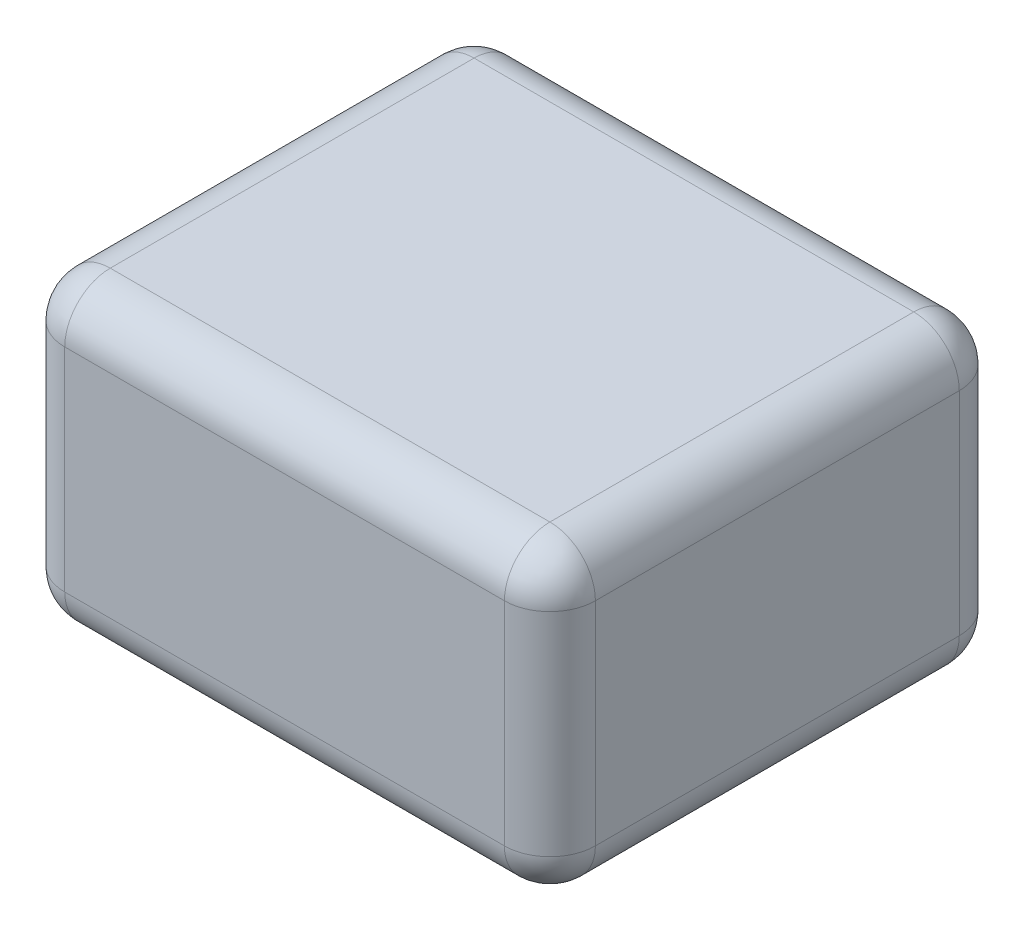
ISO-10303-21;
HEADER;
FILE_DESCRIPTION(('STEP AP214'),'2;1');
FILE_NAME('part.step','',(''),(''),'','','');
FILE_SCHEMA(('AUTOMOTIVE_DESIGN { 1 0 10303 214 1 1 1 1 }'));
ENDSEC;
DATA;
#1=APPLICATION_CONTEXT('core data for automotive mechanical design processes');
#2=APPLICATION_PROTOCOL_DEFINITION('international standard','automotive_design',2000,#1);
#3=PRODUCT_CONTEXT('',#1,'mechanical');
#4=PRODUCT('Part','Part','',(#3));
#5=PRODUCT_RELATED_PRODUCT_CATEGORY('part','',(#4));
#6=PRODUCT_DEFINITION_FORMATION('','',#4);
#7=PRODUCT_DEFINITION_CONTEXT('part definition',#1,'design');
#8=PRODUCT_DEFINITION('design','',#6,#7);
#9=PRODUCT_DEFINITION_SHAPE('','',#8);
#10=(LENGTH_UNIT() NAMED_UNIT(*) SI_UNIT(.MILLI.,.METRE.));
#11=(NAMED_UNIT(*) PLANE_ANGLE_UNIT() SI_UNIT($,.RADIAN.));
#12=(NAMED_UNIT(*) SI_UNIT($,.STERADIAN.) SOLID_ANGLE_UNIT());
#13=UNCERTAINTY_MEASURE_WITH_UNIT(LENGTH_MEASURE(1.E-05),#10,'distance_accuracy_value','');
#14=(GEOMETRIC_REPRESENTATION_CONTEXT(3) GLOBAL_UNCERTAINTY_ASSIGNED_CONTEXT((#13)) GLOBAL_UNIT_ASSIGNED_CONTEXT((#10,
#11,#12)) REPRESENTATION_CONTEXT('',''));
#15=CARTESIAN_POINT('',(0.,0.,0.));
#16=DIRECTION('',(0.,0.,1.));
#17=DIRECTION('',(1.,0.,0.));
#18=AXIS2_PLACEMENT_3D('',#15,#16,#17);
#19=CARTESIAN_POINT('',(-116.59189935397,-359.777465672961,30.));
#20=DIRECTION('',(1.,0.,0.));
#21=DIRECTION('',(0.,0.,-1.));
#22=AXIS2_PLACEMENT_3D('',#19,#20,#21);
#23=PLANE('',#22);
#24=DIRECTION('',(0.,0.,-1.));
#25=VECTOR('',#24,1.);
#26=CARTESIAN_POINT('',(-116.59189935397,-362.777465672962,30.));
#27=LINE('',#26,#25);
#28=CARTESIAN_POINT('',(-116.59189935397,-362.777465672962,27.));
#29=VERTEX_POINT('',#28);
#30=CARTESIAN_POINT('',(-116.59189935397,-362.777465672962,3.));
#31=VERTEX_POINT('',#30);
#32=EDGE_CURVE('E170',#29,#31,#27,.T.);
#33=ORIENTED_EDGE('',*,*,#32,.T.);
#34=DIRECTION('',(0.,-1.,0.));
#35=VECTOR('',#34,1.);
#36=CARTESIAN_POINT('',(-116.59189935397,-359.777465672961,3.));
#37=LINE('',#36,#35);
#38=CARTESIAN_POINT('',(-116.59189935397,-376.777465672961,3.));
#39=VERTEX_POINT('',#38);
#40=EDGE_CURVE('E175',#31,#39,#37,.T.);
#41=ORIENTED_EDGE('',*,*,#40,.T.);
#42=DIRECTION('',(0.,0.,-1.));
#43=VECTOR('',#42,1.);
#44=CARTESIAN_POINT('',(-116.59189935397,-376.777465672961,30.));
#45=LINE('',#44,#43);
#46=CARTESIAN_POINT('',(-116.59189935397,-376.777465672961,27.));
#47=VERTEX_POINT('',#46);
#48=EDGE_CURVE('E172',#39,#47,#45,.F.);
#49=ORIENTED_EDGE('',*,*,#48,.T.);
#50=DIRECTION('',(0.,-1.,0.));
#51=VECTOR('',#50,1.);
#52=CARTESIAN_POINT('',(-116.59189935397,-359.777465672961,27.));
#53=LINE('',#52,#51);
#54=EDGE_CURVE('E168',#47,#29,#53,.F.);
#55=ORIENTED_EDGE('',*,*,#54,.T.);
#56=EDGE_LOOP('',(#33,#41,#49,#55));
#57=FACE_BOUND('',#56,.T.);
#58=ADVANCED_FACE('F37',(#57),#23,.F.);
#59=CARTESIAN_POINT('',(-116.59189935397,-379.777465672961,30.));
#60=DIRECTION('',(0.,1.,0.));
#61=DIRECTION('',(-1.,0.,0.));
#62=AXIS2_PLACEMENT_3D('',#59,#60,#61);
#63=PLANE('',#62);
#64=DIRECTION('',(0.,0.,-1.));
#65=VECTOR('',#64,1.);
#66=CARTESIAN_POINT('',(-113.59189935397,-379.777465672961,30.));
#67=LINE('',#66,#65);
#68=CARTESIAN_POINT('',(-113.59189935397,-379.777465672961,27.));
#69=VERTEX_POINT('',#68);
#70=CARTESIAN_POINT('',(-113.59189935397,-379.777465672961,3.));
#71=VERTEX_POINT('',#70);
#72=EDGE_CURVE('E139',#69,#71,#67,.T.);
#73=ORIENTED_EDGE('',*,*,#72,.T.);
#74=DIRECTION('',(1.,0.,0.));
#75=VECTOR('',#74,1.);
#76=CARTESIAN_POINT('',(-116.59189935397,-379.777465672961,3.));
#77=LINE('',#76,#75);
#78=CARTESIAN_POINT('',(-84.5918993539698,-379.777465672962,3.));
#79=VERTEX_POINT('',#78);
#80=EDGE_CURVE('E135',#71,#79,#77,.T.);
#81=ORIENTED_EDGE('',*,*,#80,.T.);
#82=DIRECTION('',(0.,0.,-1.));
#83=VECTOR('',#82,1.);
#84=CARTESIAN_POINT('',(-84.5918993539698,-379.777465672962,30.));
#85=LINE('',#84,#83);
#86=CARTESIAN_POINT('',(-84.5918993539698,-379.777465672962,27.));
#87=VERTEX_POINT('',#86);
#88=EDGE_CURVE('E128',#79,#87,#85,.F.);
#89=ORIENTED_EDGE('',*,*,#88,.T.);
#90=DIRECTION('',(1.,0.,0.));
#91=VECTOR('',#90,1.);
#92=CARTESIAN_POINT('',(-116.59189935397,-379.777465672961,27.));
#93=LINE('',#92,#91);
#94=EDGE_CURVE('E133',#87,#69,#93,.F.);
#95=ORIENTED_EDGE('',*,*,#94,.T.);
#96=EDGE_LOOP('',(#73,#81,#89,#95));
#97=FACE_BOUND('',#96,.T.);
#98=ADVANCED_FACE('F131',(#97),#63,.F.);
#99=CARTESIAN_POINT('',(-81.5918993539698,-359.777465672961,30.));
#100=DIRECTION('',(-1.,0.,0.));
#101=DIRECTION('',(0.,0.,1.));
#102=AXIS2_PLACEMENT_3D('',#99,#100,#101);
#103=PLANE('',#102);
#104=DIRECTION('',(0.,0.,-1.));
#105=VECTOR('',#104,1.);
#106=CARTESIAN_POINT('',(-81.5918993539698,-376.777465672962,30.));
#107=LINE('',#106,#105);
#108=CARTESIAN_POINT('',(-81.5918993539698,-376.777465672962,27.));
#109=VERTEX_POINT('',#108);
#110=CARTESIAN_POINT('',(-81.5918993539698,-376.777465672962,3.));
#111=VERTEX_POINT('',#110);
#112=EDGE_CURVE('E147',#109,#111,#107,.T.);
#113=ORIENTED_EDGE('',*,*,#112,.T.);
#114=DIRECTION('',(0.,1.,0.));
#115=VECTOR('',#114,1.);
#116=CARTESIAN_POINT('',(-81.5918993539698,-359.777465672961,3.));
#117=LINE('',#116,#115);
#118=CARTESIAN_POINT('',(-81.5918993539698,-362.777465672962,3.));
#119=VERTEX_POINT('',#118);
#120=EDGE_CURVE('E191',#111,#119,#117,.T.);
#121=ORIENTED_EDGE('',*,*,#120,.T.);
#122=DIRECTION('',(0.,0.,-1.));
#123=VECTOR('',#122,1.);
#124=CARTESIAN_POINT('',(-81.5918993539698,-362.777465672962,30.));
#125=LINE('',#124,#123);
#126=CARTESIAN_POINT('',(-81.5918993539698,-362.777465672962,27.));
#127=VERTEX_POINT('',#126);
#128=EDGE_CURVE('E188',#119,#127,#125,.F.);
#129=ORIENTED_EDGE('',*,*,#128,.T.);
#130=DIRECTION('',(0.,1.,0.));
#131=VECTOR('',#130,1.);
#132=CARTESIAN_POINT('',(-81.5918993539698,-379.777465672962,27.));
#133=LINE('',#132,#131);
#134=EDGE_CURVE('E186',#127,#109,#133,.F.);
#135=ORIENTED_EDGE('',*,*,#134,.T.);
#136=EDGE_LOOP('',(#113,#121,#129,#135));
#137=FACE_BOUND('',#136,.T.);
#138=ADVANCED_FACE('F301',(#137),#103,.F.);
#139=CARTESIAN_POINT('',(-116.59189935397,-359.777465672961,30.));
#140=DIRECTION('',(0.,-1.,0.));
#141=DIRECTION('',(0.,0.,-1.));
#142=AXIS2_PLACEMENT_3D('',#139,#140,#141);
#143=PLANE('',#142);
#144=DIRECTION('',(0.,0.,-1.));
#145=VECTOR('',#144,1.);
#146=CARTESIAN_POINT('',(-84.5918993539698,-359.777465672961,30.));
#147=LINE('',#146,#145);
#148=CARTESIAN_POINT('',(-84.5918993539698,-359.777465672961,27.));
#149=VERTEX_POINT('',#148);
#150=CARTESIAN_POINT('',(-84.5918993539698,-359.777465672961,3.));
#151=VERTEX_POINT('',#150);
#152=EDGE_CURVE('E179',#149,#151,#147,.T.);
#153=ORIENTED_EDGE('',*,*,#152,.T.);
#154=DIRECTION('',(-1.,0.,0.));
#155=VECTOR('',#154,1.);
#156=CARTESIAN_POINT('',(-116.59189935397,-359.777465672961,3.));
#157=LINE('',#156,#155);
#158=CARTESIAN_POINT('',(-113.59189935397,-359.777465672961,3.));
#159=VERTEX_POINT('',#158);
#160=EDGE_CURVE('E184',#151,#159,#157,.T.);
#161=ORIENTED_EDGE('',*,*,#160,.T.);
#162=DIRECTION('',(0.,0.,-1.));
#163=VECTOR('',#162,1.);
#164=CARTESIAN_POINT('',(-113.59189935397,-359.777465672961,30.));
#165=LINE('',#164,#163);
#166=CARTESIAN_POINT('',(-113.59189935397,-359.777465672961,27.));
#167=VERTEX_POINT('',#166);
#168=EDGE_CURVE('E181',#159,#167,#165,.F.);
#169=ORIENTED_EDGE('',*,*,#168,.T.);
#170=DIRECTION('',(-1.,0.,0.));
#171=VECTOR('',#170,1.);
#172=CARTESIAN_POINT('',(-81.5918993539698,-359.777465672961,27.));
#173=LINE('',#172,#171);
#174=EDGE_CURVE('E177',#167,#149,#173,.F.);
#175=ORIENTED_EDGE('',*,*,#174,.T.);
#176=EDGE_LOOP('',(#153,#161,#169,#175));
#177=FACE_BOUND('',#176,.T.);
#178=ADVANCED_FACE('F278',(#177),#143,.F.);
#179=CARTESIAN_POINT('',(0.,0.,30.));
#180=DIRECTION('',(0.,0.,1.));
#181=DIRECTION('',(1.,0.,0.));
#182=AXIS2_PLACEMENT_3D('',#179,#180,#181);
#183=PLANE('',#182);
#184=DIRECTION('',(0.,-1.,0.));
#185=VECTOR('',#184,1.);
#186=CARTESIAN_POINT('',(-113.59189935397,-379.777465672961,30.));
#187=LINE('',#186,#185);
#188=CARTESIAN_POINT('',(-113.59189935397,-362.777465672962,30.));
#189=VERTEX_POINT('',#188);
#190=CARTESIAN_POINT('',(-113.59189935397,-376.777465672961,30.));
#191=VERTEX_POINT('',#190);
#192=EDGE_CURVE('E46',#189,#191,#187,.T.);
#193=ORIENTED_EDGE('',*,*,#192,.T.);
#194=DIRECTION('',(1.,0.,0.));
#195=VECTOR('',#194,1.);
#196=CARTESIAN_POINT('',(-81.5918993539698,-376.777465672962,30.));
#197=LINE('',#196,#195);
#198=CARTESIAN_POINT('',(-84.5918993539698,-376.777465672962,30.));
#199=VERTEX_POINT('',#198);
#200=EDGE_CURVE('E11',#191,#199,#197,.T.);
#201=ORIENTED_EDGE('',*,*,#200,.T.);
#202=DIRECTION('',(0.,1.,0.));
#203=VECTOR('',#202,1.);
#204=CARTESIAN_POINT('',(-84.5918993539698,-359.777465672961,30.));
#205=LINE('',#204,#203);
#206=CARTESIAN_POINT('',(-84.5918993539698,-362.777465672962,30.));
#207=VERTEX_POINT('',#206);
#208=EDGE_CURVE('E204',#199,#207,#205,.T.);
#209=ORIENTED_EDGE('',*,*,#208,.T.);
#210=DIRECTION('',(-1.,0.,0.));
#211=VECTOR('',#210,1.);
#212=CARTESIAN_POINT('',(-116.59189935397,-362.777465672962,30.));
#213=LINE('',#212,#211);
#214=EDGE_CURVE('E202',#207,#189,#213,.T.);
#215=ORIENTED_EDGE('',*,*,#214,.T.);
#216=EDGE_LOOP('',(#193,#201,#209,#215));
#217=FACE_BOUND('',#216,.T.);
#218=ADVANCED_FACE('F308',(#217),#183,.T.);
#219=CARTESIAN_POINT('',(0.,0.,0.));
#220=DIRECTION('',(0.,0.,1.));
#221=DIRECTION('',(1.,0.,0.));
#222=AXIS2_PLACEMENT_3D('',#219,#220,#221);
#223=PLANE('',#222);
#224=DIRECTION('',(0.,1.,0.));
#225=VECTOR('',#224,1.);
#226=CARTESIAN_POINT('',(-84.5918993539698,0.,0.));
#227=LINE('',#226,#225);
#228=CARTESIAN_POINT('',(-84.5918993539698,-362.777465672962,0.));
#229=VERTEX_POINT('',#228);
#230=CARTESIAN_POINT('',(-84.5918993539698,-376.777465672962,0.));
#231=VERTEX_POINT('',#230);
#232=EDGE_CURVE('E193',#229,#231,#227,.F.);
#233=ORIENTED_EDGE('',*,*,#232,.T.);
#234=DIRECTION('',(1.,0.,0.));
#235=VECTOR('',#234,1.);
#236=CARTESIAN_POINT('',(-5.97581453642909E-13,-376.777465672962,0.));
#237=LINE('',#236,#235);
#238=CARTESIAN_POINT('',(-113.59189935397,-376.777465672961,0.));
#239=VERTEX_POINT('',#238);
#240=EDGE_CURVE('E199',#231,#239,#237,.F.);
#241=ORIENTED_EDGE('',*,*,#240,.T.);
#242=DIRECTION('',(0.,-1.,0.));
#243=VECTOR('',#242,1.);
#244=CARTESIAN_POINT('',(-113.59189935397,0.,0.));
#245=LINE('',#244,#243);
#246=CARTESIAN_POINT('',(-113.59189935397,-362.777465672962,0.));
#247=VERTEX_POINT('',#246);
#248=EDGE_CURVE('E197',#239,#247,#245,.F.);
#249=ORIENTED_EDGE('',*,*,#248,.T.);
#250=DIRECTION('',(-1.,0.,0.));
#251=VECTOR('',#250,1.);
#252=CARTESIAN_POINT('',(0.,-362.777465672962,0.));
#253=LINE('',#252,#251);
#254=EDGE_CURVE('E195',#247,#229,#253,.F.);
#255=ORIENTED_EDGE('',*,*,#254,.T.);
#256=EDGE_LOOP('',(#233,#241,#249,#255));
#257=FACE_BOUND('',#256,.T.);
#258=ADVANCED_FACE('F269',(#257),#223,.F.);
#259=CARTESIAN_POINT('',(-84.5918993539698,-362.777465672962,30.));
#260=DIRECTION('',(0.,0.,-1.));
#261=DIRECTION('',(-1.,0.,0.));
#262=AXIS2_PLACEMENT_3D('',#259,#260,#261);
#263=CYLINDRICAL_SURFACE('',#262,3.);
#264=CARTESIAN_POINT('',(-84.5918993539698,-362.777465672962,27.));
#265=DIRECTION('',(0.,0.,1.));
#266=DIRECTION('',(1.,0.,0.));
#267=AXIS2_PLACEMENT_3D('',#264,#265,#266);
#268=CIRCLE('',#267,3.);
#269=EDGE_CURVE('E41',#127,#149,#268,.T.);
#270=ORIENTED_EDGE('',*,*,#269,.F.);
#271=ORIENTED_EDGE('',*,*,#128,.F.);
#272=CARTESIAN_POINT('',(-84.5918993539698,-362.777465672962,3.));
#273=DIRECTION('',(0.,0.,-1.));
#274=DIRECTION('',(-1.,0.,0.));
#275=AXIS2_PLACEMENT_3D('',#272,#273,#274);
#276=CIRCLE('',#275,3.);
#277=EDGE_CURVE('E164',#151,#119,#276,.T.);
#278=ORIENTED_EDGE('',*,*,#277,.F.);
#279=ORIENTED_EDGE('',*,*,#152,.F.);
#280=EDGE_LOOP('',(#270,#271,#278,#279));
#281=FACE_BOUND('',#280,.T.);
#282=ADVANCED_FACE('F39',(#281),#263,.T.);
#283=CARTESIAN_POINT('',(-84.5918993539698,-362.777465672962,27.));
#284=DIRECTION('',(0.,1.,0.));
#285=DIRECTION('',(0.,0.,1.));
#286=AXIS2_PLACEMENT_3D('',#283,#284,#285);
#287=SPHERICAL_SURFACE('',#286,3.);
#288=CARTESIAN_POINT('',(-84.5918993539698,-362.777465672962,27.));
#289=DIRECTION('',(0.,1.,0.));
#290=DIRECTION('',(0.,0.,1.));
#291=AXIS2_PLACEMENT_3D('',#288,#289,#290);
#292=CIRCLE('',#291,3.);
#293=EDGE_CURVE('E247',#127,#207,#292,.F.);
#294=ORIENTED_EDGE('',*,*,#293,.F.);
#295=ORIENTED_EDGE('',*,*,#269,.T.);
#296=CARTESIAN_POINT('',(-84.5918993539698,-362.777465672962,27.));
#297=DIRECTION('',(1.,0.,0.));
#298=DIRECTION('',(0.,0.,-1.));
#299=AXIS2_PLACEMENT_3D('',#296,#297,#298);
#300=CIRCLE('',#299,3.);
#301=EDGE_CURVE('E250',#207,#149,#300,.F.);
#302=ORIENTED_EDGE('',*,*,#301,.F.);
#303=EDGE_LOOP('',(#294,#295,#302));
#304=FACE_BOUND('',#303,.T.);
#305=ADVANCED_FACE('F296',(#304),#287,.T.);
#306=CARTESIAN_POINT('',(-84.5918993539698,-362.777465672962,3.));
#307=DIRECTION('',(1.,0.,0.));
#308=DIRECTION('',(0.,0.,-1.));
#309=AXIS2_PLACEMENT_3D('',#306,#307,#308);
#310=SPHERICAL_SURFACE('',#309,3.);
#311=CARTESIAN_POINT('',(-84.5918993539698,-362.777465672962,3.));
#312=DIRECTION('',(1.,0.,0.));
#313=DIRECTION('',(0.,0.,-1.));
#314=AXIS2_PLACEMENT_3D('',#311,#312,#313);
#315=CIRCLE('',#314,3.);
#316=EDGE_CURVE('E241',#151,#229,#315,.F.);
#317=ORIENTED_EDGE('',*,*,#316,.F.);
#318=ORIENTED_EDGE('',*,*,#277,.T.);
#319=CARTESIAN_POINT('',(-84.5918993539698,-362.777465672962,3.));
#320=DIRECTION('',(0.,1.,0.));
#321=DIRECTION('',(0.,0.,1.));
#322=AXIS2_PLACEMENT_3D('',#319,#320,#321);
#323=CIRCLE('',#322,3.);
#324=EDGE_CURVE('E244',#229,#119,#323,.F.);
#325=ORIENTED_EDGE('',*,*,#324,.F.);
#326=EDGE_LOOP('',(#317,#318,#325));
#327=FACE_BOUND('',#326,.T.);
#328=ADVANCED_FACE('F257',(#327),#310,.T.);
#329=CARTESIAN_POINT('',(0.,-362.777465672962,27.));
#330=DIRECTION('',(1.,0.,0.));
#331=DIRECTION('',(0.,0.,-1.));
#332=AXIS2_PLACEMENT_3D('',#329,#330,#331);
#333=CYLINDRICAL_SURFACE('',#332,3.);
#334=ORIENTED_EDGE('',*,*,#301,.T.);
#335=ORIENTED_EDGE('',*,*,#174,.F.);
#336=CARTESIAN_POINT('',(-113.59189935397,-362.777465672962,27.));
#337=DIRECTION('',(-1.,0.,0.));
#338=DIRECTION('',(0.,0.,1.));
#339=AXIS2_PLACEMENT_3D('',#336,#337,#338);
#340=CIRCLE('',#339,3.);
#341=EDGE_CURVE('E236',#189,#167,#340,.T.);
#342=ORIENTED_EDGE('',*,*,#341,.F.);
#343=ORIENTED_EDGE('',*,*,#214,.F.);
#344=EDGE_LOOP('',(#334,#335,#342,#343));
#345=FACE_BOUND('',#344,.T.);
#346=ADVANCED_FACE('F290',(#345),#333,.T.);
#347=CARTESIAN_POINT('',(-84.5918993539698,0.,27.));
#348=DIRECTION('',(0.,-1.,0.));
#349=DIRECTION('',(0.,0.,-1.));
#350=AXIS2_PLACEMENT_3D('',#347,#348,#349);
#351=CYLINDRICAL_SURFACE('',#350,3.);
#352=ORIENTED_EDGE('',*,*,#293,.T.);
#353=ORIENTED_EDGE('',*,*,#208,.F.);
#354=CARTESIAN_POINT('',(-84.5918993539698,-376.777465672962,27.));
#355=DIRECTION('',(0.,-1.,0.));
#356=DIRECTION('',(0.,0.,-1.));
#357=AXIS2_PLACEMENT_3D('',#354,#355,#356);
#358=CIRCLE('',#357,3.);
#359=EDGE_CURVE('E151',#109,#199,#358,.T.);
#360=ORIENTED_EDGE('',*,*,#359,.F.);
#361=ORIENTED_EDGE('',*,*,#134,.F.);
#362=EDGE_LOOP('',(#352,#353,#360,#361));
#363=FACE_BOUND('',#362,.T.);
#364=ADVANCED_FACE('F299',(#363),#351,.T.);
#365=CARTESIAN_POINT('',(-84.5918993539698,-376.777465672962,30.));
#366=DIRECTION('',(0.,0.,-1.));
#367=DIRECTION('',(-1.,0.,0.));
#368=AXIS2_PLACEMENT_3D('',#365,#366,#367);
#369=CYLINDRICAL_SURFACE('',#368,3.);
#370=CARTESIAN_POINT('',(-84.5918993539698,-376.777465672962,3.));
#371=DIRECTION('',(0.,0.,-1.));
#372=DIRECTION('',(-1.,0.,0.));
#373=AXIS2_PLACEMENT_3D('',#370,#371,#372);
#374=CIRCLE('',#373,3.);
#375=EDGE_CURVE('E152',#111,#79,#374,.T.);
#376=ORIENTED_EDGE('',*,*,#375,.F.);
#377=ORIENTED_EDGE('',*,*,#112,.F.);
#378=CARTESIAN_POINT('',(-84.5918993539698,-376.777465672962,27.));
#379=DIRECTION('',(0.,0.,1.));
#380=DIRECTION('',(1.,0.,0.));
#381=AXIS2_PLACEMENT_3D('',#378,#379,#380);
#382=CIRCLE('',#381,3.);
#383=EDGE_CURVE('E143',#87,#109,#382,.T.);
#384=ORIENTED_EDGE('',*,*,#383,.F.);
#385=ORIENTED_EDGE('',*,*,#88,.F.);
#386=EDGE_LOOP('',(#376,#377,#384,#385));
#387=FACE_BOUND('',#386,.T.);
#388=ADVANCED_FACE('F145',(#387),#369,.T.);
#389=CARTESIAN_POINT('',(-84.5918993539698,-359.777465672961,3.));
#390=DIRECTION('',(0.,1.,0.));
#391=DIRECTION('',(0.,0.,1.));
#392=AXIS2_PLACEMENT_3D('',#389,#390,#391);
#393=CYLINDRICAL_SURFACE('',#392,3.);
#394=ORIENTED_EDGE('',*,*,#324,.T.);
#395=ORIENTED_EDGE('',*,*,#120,.F.);
#396=CARTESIAN_POINT('',(-84.5918993539698,-376.777465672962,3.));
#397=DIRECTION('',(0.,-1.,0.));
#398=DIRECTION('',(0.,0.,-1.));
#399=AXIS2_PLACEMENT_3D('',#396,#397,#398);
#400=CIRCLE('',#399,3.);
#401=EDGE_CURVE('E232',#231,#111,#400,.T.);
#402=ORIENTED_EDGE('',*,*,#401,.F.);
#403=ORIENTED_EDGE('',*,*,#232,.F.);
#404=EDGE_LOOP('',(#394,#395,#402,#403));
#405=FACE_BOUND('',#404,.T.);
#406=ADVANCED_FACE('F265',(#405),#393,.T.);
#407=CARTESIAN_POINT('',(-116.59189935397,-362.777465672962,3.));
#408=DIRECTION('',(-1.,0.,0.));
#409=DIRECTION('',(0.,0.,1.));
#410=AXIS2_PLACEMENT_3D('',#407,#408,#409);
#411=CYLINDRICAL_SURFACE('',#410,3.);
#412=ORIENTED_EDGE('',*,*,#316,.T.);
#413=ORIENTED_EDGE('',*,*,#254,.F.);
#414=CARTESIAN_POINT('',(-113.59189935397,-362.777465672962,3.));
#415=DIRECTION('',(-1.,0.,0.));
#416=DIRECTION('',(0.,0.,1.));
#417=AXIS2_PLACEMENT_3D('',#414,#415,#416);
#418=CIRCLE('',#417,3.);
#419=EDGE_CURVE('E229',#159,#247,#418,.T.);
#420=ORIENTED_EDGE('',*,*,#419,.F.);
#421=ORIENTED_EDGE('',*,*,#160,.F.);
#422=EDGE_LOOP('',(#412,#413,#420,#421));
#423=FACE_BOUND('',#422,.T.);
#424=ADVANCED_FACE('F275',(#423),#411,.T.);
#425=CARTESIAN_POINT('',(-113.59189935397,-362.777465672962,30.));
#426=DIRECTION('',(0.,0.,-1.));
#427=DIRECTION('',(-1.,0.,0.));
#428=AXIS2_PLACEMENT_3D('',#425,#426,#427);
#429=CYLINDRICAL_SURFACE('',#428,3.);
#430=CARTESIAN_POINT('',(-113.59189935397,-362.777465672962,27.));
#431=DIRECTION('',(0.,0.,1.));
#432=DIRECTION('',(1.,0.,0.));
#433=AXIS2_PLACEMENT_3D('',#430,#431,#432);
#434=CIRCLE('',#433,3.);
#435=EDGE_CURVE('E238',#167,#29,#434,.T.);
#436=ORIENTED_EDGE('',*,*,#435,.F.);
#437=ORIENTED_EDGE('',*,*,#168,.F.);
#438=CARTESIAN_POINT('',(-113.59189935397,-362.777465672962,3.));
#439=DIRECTION('',(0.,0.,-1.));
#440=DIRECTION('',(-1.,0.,0.));
#441=AXIS2_PLACEMENT_3D('',#438,#439,#440);
#442=CIRCLE('',#441,3.);
#443=EDGE_CURVE('E226',#31,#159,#442,.T.);
#444=ORIENTED_EDGE('',*,*,#443,.F.);
#445=ORIENTED_EDGE('',*,*,#32,.F.);
#446=EDGE_LOOP('',(#436,#437,#444,#445));
#447=FACE_BOUND('',#446,.T.);
#448=ADVANCED_FACE('F282',(#447),#429,.T.);
#449=CARTESIAN_POINT('',(-113.59189935397,-362.777465672962,27.));
#450=DIRECTION('',(0.,1.,0.));
#451=DIRECTION('',(0.,0.,1.));
#452=AXIS2_PLACEMENT_3D('',#449,#450,#451);
#453=SPHERICAL_SURFACE('',#452,3.);
#454=ORIENTED_EDGE('',*,*,#341,.T.);
#455=ORIENTED_EDGE('',*,*,#435,.T.);
#456=CARTESIAN_POINT('',(-113.59189935397,-362.777465672962,27.));
#457=DIRECTION('',(0.,1.,0.));
#458=DIRECTION('',(0.,0.,1.));
#459=AXIS2_PLACEMENT_3D('',#456,#457,#458);
#460=CIRCLE('',#459,3.);
#461=EDGE_CURVE('E158',#189,#29,#460,.F.);
#462=ORIENTED_EDGE('',*,*,#461,.F.);
#463=EDGE_LOOP('',(#454,#455,#462));
#464=FACE_BOUND('',#463,.T.);
#465=ADVANCED_FACE('F352',(#464),#453,.T.);
#466=CARTESIAN_POINT('',(-84.5918993539698,-376.777465672962,27.));
#467=DIRECTION('',(1.,0.,0.));
#468=DIRECTION('',(0.,0.,-1.));
#469=AXIS2_PLACEMENT_3D('',#466,#467,#468);
#470=SPHERICAL_SURFACE('',#469,3.);
#471=ORIENTED_EDGE('',*,*,#383,.T.);
#472=ORIENTED_EDGE('',*,*,#359,.T.);
#473=CARTESIAN_POINT('',(-84.5918993539698,-376.777465672962,27.));
#474=DIRECTION('',(1.,0.,0.));
#475=DIRECTION('',(0.,0.,-1.));
#476=AXIS2_PLACEMENT_3D('',#473,#474,#475);
#477=CIRCLE('',#476,3.);
#478=EDGE_CURVE('E155',#87,#199,#477,.F.);
#479=ORIENTED_EDGE('',*,*,#478,.F.);
#480=EDGE_LOOP('',(#471,#472,#479));
#481=FACE_BOUND('',#480,.T.);
#482=ADVANCED_FACE('F156',(#481),#470,.T.);
#483=CARTESIAN_POINT('',(-84.5918993539698,-376.777465672962,3.));
#484=DIRECTION('',(1.,0.,0.));
#485=DIRECTION('',(0.,0.,-1.));
#486=AXIS2_PLACEMENT_3D('',#483,#484,#485);
#487=SPHERICAL_SURFACE('',#486,3.);
#488=ORIENTED_EDGE('',*,*,#401,.T.);
#489=ORIENTED_EDGE('',*,*,#375,.T.);
#490=CARTESIAN_POINT('',(-84.5918993539698,-376.777465672962,3.));
#491=DIRECTION('',(1.,0.,0.));
#492=DIRECTION('',(0.,0.,-1.));
#493=AXIS2_PLACEMENT_3D('',#490,#491,#492);
#494=CIRCLE('',#493,3.);
#495=EDGE_CURVE('E159',#231,#79,#494,.F.);
#496=ORIENTED_EDGE('',*,*,#495,.F.);
#497=EDGE_LOOP('',(#488,#489,#496));
#498=FACE_BOUND('',#497,.T.);
#499=ADVANCED_FACE('F345',(#498),#487,.T.);
#500=CARTESIAN_POINT('',(-113.59189935397,-362.777465672962,3.));
#501=DIRECTION('',(0.,1.,0.));
#502=DIRECTION('',(0.,0.,1.));
#503=AXIS2_PLACEMENT_3D('',#500,#501,#502);
#504=SPHERICAL_SURFACE('',#503,3.);
#505=ORIENTED_EDGE('',*,*,#443,.T.);
#506=ORIENTED_EDGE('',*,*,#419,.T.);
#507=CARTESIAN_POINT('',(-113.59189935397,-362.777465672962,3.));
#508=DIRECTION('',(0.,1.,0.));
#509=DIRECTION('',(0.,0.,1.));
#510=AXIS2_PLACEMENT_3D('',#507,#508,#509);
#511=CIRCLE('',#510,3.);
#512=EDGE_CURVE('E219',#31,#247,#511,.F.);
#513=ORIENTED_EDGE('',*,*,#512,.F.);
#514=EDGE_LOOP('',(#505,#506,#513));
#515=FACE_BOUND('',#514,.T.);
#516=ADVANCED_FACE('F341',(#515),#504,.T.);
#517=CARTESIAN_POINT('',(-113.59189935397,0.,27.));
#518=DIRECTION('',(0.,1.,0.));
#519=DIRECTION('',(0.,0.,1.));
#520=AXIS2_PLACEMENT_3D('',#517,#518,#519);
#521=CYLINDRICAL_SURFACE('',#520,3.);
#522=ORIENTED_EDGE('',*,*,#461,.T.);
#523=ORIENTED_EDGE('',*,*,#54,.F.);
#524=CARTESIAN_POINT('',(-113.59189935397,-376.777465672961,27.));
#525=DIRECTION('',(0.,-1.,0.));
#526=DIRECTION('',(0.,0.,-1.));
#527=AXIS2_PLACEMENT_3D('',#524,#525,#526);
#528=CIRCLE('',#527,3.);
#529=EDGE_CURVE('E217',#191,#47,#528,.T.);
#530=ORIENTED_EDGE('',*,*,#529,.F.);
#531=ORIENTED_EDGE('',*,*,#192,.F.);
#532=EDGE_LOOP('',(#522,#523,#530,#531));
#533=FACE_BOUND('',#532,.T.);
#534=ADVANCED_FACE('F338',(#533),#521,.T.);
#535=CARTESIAN_POINT('',(-5.97581453642909E-13,-376.777465672962,27.));
#536=DIRECTION('',(-1.,0.,0.));
#537=DIRECTION('',(0.,-1.,0.));
#538=AXIS2_PLACEMENT_3D('',#535,#536,#537);
#539=CYLINDRICAL_SURFACE('',#538,3.);
#540=ORIENTED_EDGE('',*,*,#478,.T.);
#541=ORIENTED_EDGE('',*,*,#200,.F.);
#542=CARTESIAN_POINT('',(-113.59189935397,-376.777465672961,27.));
#543=DIRECTION('',(-1.,0.,0.));
#544=DIRECTION('',(0.,0.,1.));
#545=AXIS2_PLACEMENT_3D('',#542,#543,#544);
#546=CIRCLE('',#545,3.);
#547=EDGE_CURVE('E54',#69,#191,#546,.T.);
#548=ORIENTED_EDGE('',*,*,#547,.F.);
#549=ORIENTED_EDGE('',*,*,#94,.F.);
#550=EDGE_LOOP('',(#540,#541,#548,#549));
#551=FACE_BOUND('',#550,.T.);
#552=ADVANCED_FACE('F161',(#551),#539,.T.);
#553=CARTESIAN_POINT('',(-116.59189935397,-376.777465672961,3.));
#554=DIRECTION('',(1.,0.,0.));
#555=DIRECTION('',(0.,1.,0.));
#556=AXIS2_PLACEMENT_3D('',#553,#554,#555);
#557=CYLINDRICAL_SURFACE('',#556,3.);
#558=ORIENTED_EDGE('',*,*,#495,.T.);
#559=ORIENTED_EDGE('',*,*,#80,.F.);
#560=CARTESIAN_POINT('',(-113.59189935397,-376.777465672961,3.));
#561=DIRECTION('',(-1.,0.,0.));
#562=DIRECTION('',(0.,0.,1.));
#563=AXIS2_PLACEMENT_3D('',#560,#561,#562);
#564=CIRCLE('',#563,3.);
#565=EDGE_CURVE('E213',#239,#71,#564,.T.);
#566=ORIENTED_EDGE('',*,*,#565,.F.);
#567=ORIENTED_EDGE('',*,*,#240,.F.);
#568=EDGE_LOOP('',(#558,#559,#566,#567));
#569=FACE_BOUND('',#568,.T.);
#570=ADVANCED_FACE('F331',(#569),#557,.T.);
#571=CARTESIAN_POINT('',(-113.59189935397,-359.777465672961,3.));
#572=DIRECTION('',(0.,-1.,0.));
#573=DIRECTION('',(0.,0.,-1.));
#574=AXIS2_PLACEMENT_3D('',#571,#572,#573);
#575=CYLINDRICAL_SURFACE('',#574,3.);
#576=ORIENTED_EDGE('',*,*,#512,.T.);
#577=ORIENTED_EDGE('',*,*,#248,.F.);
#578=CARTESIAN_POINT('',(-113.59189935397,-376.777465672961,3.));
#579=DIRECTION('',(0.,-1.,0.));
#580=DIRECTION('',(0.,0.,-1.));
#581=AXIS2_PLACEMENT_3D('',#578,#579,#580);
#582=CIRCLE('',#581,3.);
#583=EDGE_CURVE('E211',#39,#239,#582,.T.);
#584=ORIENTED_EDGE('',*,*,#583,.F.);
#585=ORIENTED_EDGE('',*,*,#40,.F.);
#586=EDGE_LOOP('',(#576,#577,#584,#585));
#587=FACE_BOUND('',#586,.T.);
#588=ADVANCED_FACE('F328',(#587),#575,.T.);
#589=CARTESIAN_POINT('',(-113.59189935397,-376.777465672961,27.));
#590=DIRECTION('',(0.,0.,1.));
#591=DIRECTION('',(1.,0.,0.));
#592=AXIS2_PLACEMENT_3D('',#589,#590,#591);
#593=SPHERICAL_SURFACE('',#592,3.);
#594=ORIENTED_EDGE('',*,*,#547,.T.);
#595=ORIENTED_EDGE('',*,*,#529,.T.);
#596=CARTESIAN_POINT('',(-113.59189935397,-376.777465672961,27.));
#597=DIRECTION('',(0.,0.,1.));
#598=DIRECTION('',(1.,0.,0.));
#599=AXIS2_PLACEMENT_3D('',#596,#597,#598);
#600=CIRCLE('',#599,3.);
#601=EDGE_CURVE('E209',#69,#47,#600,.F.);
#602=ORIENTED_EDGE('',*,*,#601,.F.);
#603=EDGE_LOOP('',(#594,#595,#602));
#604=FACE_BOUND('',#603,.T.);
#605=ADVANCED_FACE('F324',(#604),#593,.T.);
#606=CARTESIAN_POINT('',(-113.59189935397,-376.777465672961,3.));
#607=DIRECTION('',(0.,0.,-1.));
#608=DIRECTION('',(-1.,0.,0.));
#609=AXIS2_PLACEMENT_3D('',#606,#607,#608);
#610=SPHERICAL_SURFACE('',#609,3.);
#611=ORIENTED_EDGE('',*,*,#583,.T.);
#612=ORIENTED_EDGE('',*,*,#565,.T.);
#613=CARTESIAN_POINT('',(-113.59189935397,-376.777465672961,3.));
#614=DIRECTION('',(0.,0.,-1.));
#615=DIRECTION('',(-1.,0.,0.));
#616=AXIS2_PLACEMENT_3D('',#613,#614,#615);
#617=CIRCLE('',#616,3.);
#618=EDGE_CURVE('E207',#39,#71,#617,.F.);
#619=ORIENTED_EDGE('',*,*,#618,.F.);
#620=EDGE_LOOP('',(#611,#612,#619));
#621=FACE_BOUND('',#620,.T.);
#622=ADVANCED_FACE('F320',(#621),#610,.T.);
#623=CARTESIAN_POINT('',(-113.59189935397,-376.777465672961,30.));
#624=DIRECTION('',(0.,0.,-1.));
#625=DIRECTION('',(-1.,0.,0.));
#626=AXIS2_PLACEMENT_3D('',#623,#624,#625);
#627=CYLINDRICAL_SURFACE('',#626,3.);
#628=ORIENTED_EDGE('',*,*,#601,.T.);
#629=ORIENTED_EDGE('',*,*,#48,.F.);
#630=ORIENTED_EDGE('',*,*,#618,.T.);
#631=ORIENTED_EDGE('',*,*,#72,.F.);
#632=EDGE_LOOP('',(#628,#629,#630,#631));
#633=FACE_BOUND('',#632,.T.);
#634=ADVANCED_FACE('F317',(#633),#627,.T.);
#635=CLOSED_SHELL('',(#58,#98,#138,#178,#218,#258,#282,#305,#328,#346,#364,#388,#406,#424,#448,
#465,#482,#499,#516,#534,#552,#570,#588,#605,#622,#634));
#636=MANIFOLD_SOLID_BREP('B2',#635);
#637=ADVANCED_BREP_SHAPE_REPRESENTATION('',(#18,#636),#14);
#638=SHAPE_DEFINITION_REPRESENTATION(#9,#637);
ENDSEC;
END-ISO-10303-21;
